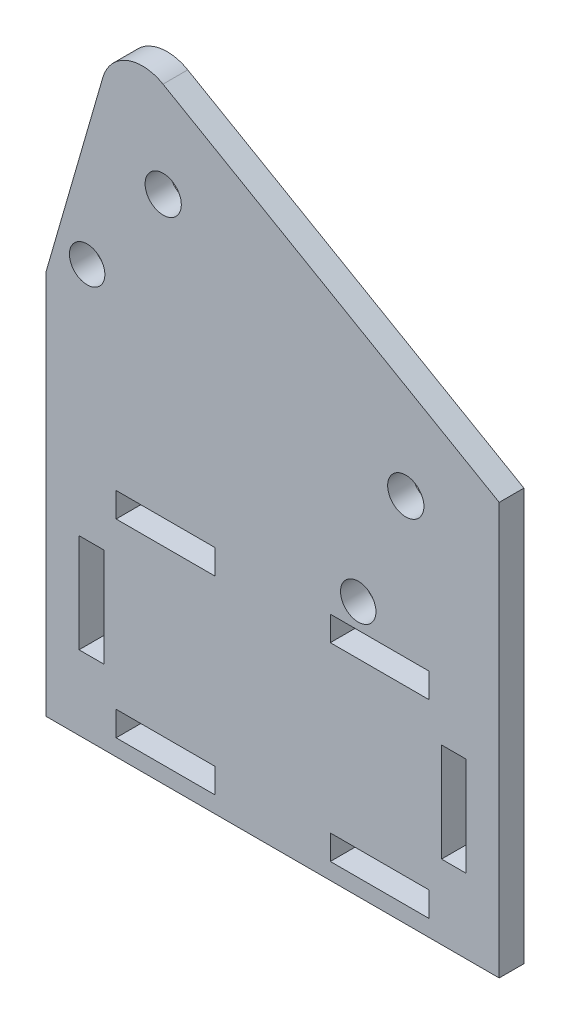
ISO-10303-21;
HEADER;
FILE_DESCRIPTION(('STEP AP214'),'2;1');
FILE_NAME('part.step','',(''),(''),'','','');
FILE_SCHEMA(('AUTOMOTIVE_DESIGN { 1 0 10303 214 1 1 1 1 }'));
ENDSEC;
DATA;
#1=APPLICATION_CONTEXT('core data for automotive mechanical design processes');
#2=APPLICATION_PROTOCOL_DEFINITION('international standard','automotive_design',2000,#1);
#3=PRODUCT_CONTEXT('',#1,'mechanical');
#4=PRODUCT('Part','Part','',(#3));
#5=PRODUCT_RELATED_PRODUCT_CATEGORY('part','',(#4));
#6=PRODUCT_DEFINITION_FORMATION('','',#4);
#7=PRODUCT_DEFINITION_CONTEXT('part definition',#1,'design');
#8=PRODUCT_DEFINITION('design','',#6,#7);
#9=PRODUCT_DEFINITION_SHAPE('','',#8);
#10=(LENGTH_UNIT() NAMED_UNIT(*) SI_UNIT(.MILLI.,.METRE.));
#11=(NAMED_UNIT(*) PLANE_ANGLE_UNIT() SI_UNIT($,.RADIAN.));
#12=(NAMED_UNIT(*) SI_UNIT($,.STERADIAN.) SOLID_ANGLE_UNIT());
#13=UNCERTAINTY_MEASURE_WITH_UNIT(LENGTH_MEASURE(1.E-05),#10,'distance_accuracy_value','');
#14=(GEOMETRIC_REPRESENTATION_CONTEXT(3) GLOBAL_UNCERTAINTY_ASSIGNED_CONTEXT((#13)) GLOBAL_UNIT_ASSIGNED_CONTEXT((#10,
#11,#12)) REPRESENTATION_CONTEXT('',''));
#15=CARTESIAN_POINT('',(0.,0.,0.));
#16=DIRECTION('',(0.,0.,1.));
#17=DIRECTION('',(1.,0.,0.));
#18=AXIS2_PLACEMENT_3D('',#15,#16,#17);
#19=CARTESIAN_POINT('',(22.0304445662279,38.157849302036,3.));
#20=DIRECTION('',(-0.500000000000004,-0.866025403784436,0.));
#21=DIRECTION('',(0.866025403784436,-0.500000000000004,0.));
#22=AXIS2_PLACEMENT_3D('',#19,#20,#21);
#23=PLANE('',#22);
#24=DIRECTION('',(-0.866025403784436,0.500000000000004,0.));
#25=VECTOR('',#24,1.);
#26=CARTESIAN_POINT('',(22.0304445662279,38.157849302036,0.));
#27=LINE('',#26,#25);
#28=CARTESIAN_POINT('',(27.5,35.,0.));
#29=VERTEX_POINT('',#28);
#30=CARTESIAN_POINT('',(-13.3076045347281,58.5602814631093,0.));
#31=VERTEX_POINT('',#30);
#32=EDGE_CURVE('E265',#29,#31,#27,.T.);
#33=ORIENTED_EDGE('',*,*,#32,.T.);
#34=DIRECTION('',(0.,0.,1.));
#35=VECTOR('',#34,1.);
#36=CARTESIAN_POINT('',(-13.3076045347281,58.5602814631093,3.));
#37=LINE('',#36,#35);
#38=CARTESIAN_POINT('',(-13.3076045347281,58.5602814631093,3.));
#39=VERTEX_POINT('',#38);
#40=EDGE_CURVE('E289',#31,#39,#37,.T.);
#41=ORIENTED_EDGE('',*,*,#40,.T.);
#42=DIRECTION('',(-0.866025403784436,0.500000000000004,0.));
#43=VECTOR('',#42,1.);
#44=CARTESIAN_POINT('',(22.0304445662279,38.157849302036,3.));
#45=LINE('',#44,#43);
#46=CARTESIAN_POINT('',(27.5,35.,3.));
#47=VERTEX_POINT('',#46);
#48=EDGE_CURVE('E255',#47,#39,#45,.T.);
#49=ORIENTED_EDGE('',*,*,#48,.F.);
#50=DIRECTION('',(0.,0.,-1.));
#51=VECTOR('',#50,1.);
#52=CARTESIAN_POINT('',(27.5,35.,3.));
#53=LINE('',#52,#51);
#54=EDGE_CURVE('E264',#47,#29,#53,.T.);
#55=ORIENTED_EDGE('',*,*,#54,.T.);
#56=EDGE_LOOP('',(#33,#41,#49,#55));
#57=FACE_BOUND('',#56,.T.);
#58=ADVANCED_FACE('F41',(#57),#23,.F.);
#59=CARTESIAN_POINT('',(-27.5,0.,3.));
#60=DIRECTION('',(1.,0.,0.));
#61=DIRECTION('',(0.,1.,0.));
#62=AXIS2_PLACEMENT_3D('',#59,#60,#61);
#63=PLANE('',#62);
#64=DIRECTION('',(0.,-1.,0.));
#65=VECTOR('',#64,1.);
#66=CARTESIAN_POINT('',(-27.5,0.,3.));
#67=LINE('',#66,#65);
#68=CARTESIAN_POINT('',(-27.5,31.7542648054294,3.));
#69=VERTEX_POINT('',#68);
#70=CARTESIAN_POINT('',(-27.5,-15.,3.));
#71=VERTEX_POINT('',#70);
#72=EDGE_CURVE('E246',#69,#71,#67,.T.);
#73=ORIENTED_EDGE('',*,*,#72,.F.);
#74=DIRECTION('',(0.,0.,1.));
#75=VECTOR('',#74,1.);
#76=CARTESIAN_POINT('',(-27.5,31.7542648054294,-7.));
#77=LINE('',#76,#75);
#78=CARTESIAN_POINT('',(-27.5,31.7542648054294,0.));
#79=VERTEX_POINT('',#78);
#80=EDGE_CURVE('E235',#79,#69,#77,.T.);
#81=ORIENTED_EDGE('',*,*,#80,.F.);
#82=DIRECTION('',(0.,-1.,0.));
#83=VECTOR('',#82,1.);
#84=CARTESIAN_POINT('',(-27.5,0.,0.));
#85=LINE('',#84,#83);
#86=CARTESIAN_POINT('',(-27.5,-15.,0.));
#87=VERTEX_POINT('',#86);
#88=EDGE_CURVE('E268',#79,#87,#85,.T.);
#89=ORIENTED_EDGE('',*,*,#88,.T.);
#90=DIRECTION('',(0.,0.,-1.));
#91=VECTOR('',#90,1.);
#92=CARTESIAN_POINT('',(-27.5,-15.,3.));
#93=LINE('',#92,#91);
#94=EDGE_CURVE('E252',#71,#87,#93,.T.);
#95=ORIENTED_EDGE('',*,*,#94,.F.);
#96=EDGE_LOOP('',(#73,#81,#89,#95));
#97=FACE_BOUND('',#96,.T.);
#98=ADVANCED_FACE('F250',(#97),#63,.F.);
#99=CARTESIAN_POINT('',(0.,-15.,3.));
#100=DIRECTION('',(0.,1.,0.));
#101=DIRECTION('',(0.,0.,1.));
#102=AXIS2_PLACEMENT_3D('',#99,#100,#101);
#103=PLANE('',#102);
#104=DIRECTION('',(1.,0.,0.));
#105=VECTOR('',#104,1.);
#106=CARTESIAN_POINT('',(0.,-15.,0.));
#107=LINE('',#106,#105);
#108=CARTESIAN_POINT('',(27.5,-15.,0.));
#109=VERTEX_POINT('',#108);
#110=EDGE_CURVE('E271',#87,#109,#107,.T.);
#111=ORIENTED_EDGE('',*,*,#110,.T.);
#112=DIRECTION('',(0.,0.,-1.));
#113=VECTOR('',#112,1.);
#114=CARTESIAN_POINT('',(27.5,-15.,3.));
#115=LINE('',#114,#113);
#116=CARTESIAN_POINT('',(27.5,-15.,3.));
#117=VERTEX_POINT('',#116);
#118=EDGE_CURVE('E276',#117,#109,#115,.T.);
#119=ORIENTED_EDGE('',*,*,#118,.F.);
#120=DIRECTION('',(1.,0.,0.));
#121=VECTOR('',#120,1.);
#122=CARTESIAN_POINT('',(0.,-15.,3.));
#123=LINE('',#122,#121);
#124=EDGE_CURVE('E254',#71,#117,#123,.T.);
#125=ORIENTED_EDGE('',*,*,#124,.F.);
#126=ORIENTED_EDGE('',*,*,#94,.T.);
#127=EDGE_LOOP('',(#111,#119,#125,#126));
#128=FACE_BOUND('',#127,.T.);
#129=ADVANCED_FACE('F322',(#128),#103,.F.);
#130=CARTESIAN_POINT('',(27.5,0.,3.));
#131=DIRECTION('',(-1.,0.,0.));
#132=DIRECTION('',(0.,-1.,0.));
#133=AXIS2_PLACEMENT_3D('',#130,#131,#132);
#134=PLANE('',#133);
#135=DIRECTION('',(0.,1.,0.));
#136=VECTOR('',#135,1.);
#137=CARTESIAN_POINT('',(27.5,0.,0.));
#138=LINE('',#137,#136);
#139=EDGE_CURVE('E259',#109,#29,#138,.T.);
#140=ORIENTED_EDGE('',*,*,#139,.T.);
#141=ORIENTED_EDGE('',*,*,#54,.F.);
#142=DIRECTION('',(0.,1.,0.));
#143=VECTOR('',#142,1.);
#144=CARTESIAN_POINT('',(27.5,0.,3.));
#145=LINE('',#144,#143);
#146=EDGE_CURVE('E257',#117,#47,#145,.T.);
#147=ORIENTED_EDGE('',*,*,#146,.F.);
#148=ORIENTED_EDGE('',*,*,#118,.T.);
#149=EDGE_LOOP('',(#140,#141,#147,#148));
#150=FACE_BOUND('',#149,.T.);
#151=ADVANCED_FACE('F302',(#150),#134,.F.);
#152=CARTESIAN_POINT('',(0.,0.,3.));
#153=DIRECTION('',(0.,0.,1.));
#154=DIRECTION('',(1.,0.,0.));
#155=AXIS2_PLACEMENT_3D('',#152,#153,#154);
#156=PLANE('',#155);
#157=CARTESIAN_POINT('',(10.3923048454121,16.0096189432334,3.));
#158=DIRECTION('',(0.,0.,-1.));
#159=DIRECTION('',(-1.,0.,0.));
#160=AXIS2_PLACEMENT_3D('',#157,#158,#159);
#161=CIRCLE('',#160,2.15);
#162=CARTESIAN_POINT('',(8.24230484541208,16.0096189432334,3.));
#163=VERTEX_POINT('',#162);
#164=EDGE_CURVE('E248',#163,#163,#161,.T.);
#165=ORIENTED_EDGE('',*,*,#164,.T.);
#166=EDGE_LOOP('',(#165));
#167=FACE_BOUND('',#166,.T.);
#168=CARTESIAN_POINT('',(-22.5166604983966,35.0096189432333,3.));
#169=DIRECTION('',(0.,0.,-1.));
#170=DIRECTION('',(-1.,0.,0.));
#171=AXIS2_PLACEMENT_3D('',#168,#169,#170);
#172=CIRCLE('',#171,2.15);
#173=CARTESIAN_POINT('',(-24.6666604983966,35.0096189432333,3.));
#174=VERTEX_POINT('',#173);
#175=EDGE_CURVE('E453',#174,#174,#172,.T.);
#176=ORIENTED_EDGE('',*,*,#175,.T.);
#177=EDGE_LOOP('',(#176));
#178=FACE_BOUND('',#177,.T.);
#179=ORIENTED_EDGE('',*,*,#48,.T.);
#180=CARTESIAN_POINT('',(-15.8076045347281,54.2301544441871,3.));
#181=DIRECTION('',(0.,0.,1.));
#182=DIRECTION('',(1.,0.,0.));
#183=AXIS2_PLACEMENT_3D('',#180,#181,#182);
#184=CIRCLE('',#183,5.);
#185=CARTESIAN_POINT('',(-20.6114491488808,55.6169049347502,3.));
#186=VERTEX_POINT('',#185);
#187=EDGE_CURVE('E63',#39,#186,#184,.T.);
#188=ORIENTED_EDGE('',*,*,#187,.T.);
#189=DIRECTION('',(0.277350098112614,0.960768922830523,0.));
#190=VECTOR('',#189,1.);
#191=CARTESIAN_POINT('',(-18.8397459621556,61.7542648054294,3.));
#192=LINE('',#191,#190);
#193=EDGE_CURVE('E237',#69,#186,#192,.T.);
#194=ORIENTED_EDGE('',*,*,#193,.F.);
#195=ORIENTED_EDGE('',*,*,#72,.T.);
#196=ORIENTED_EDGE('',*,*,#124,.T.);
#197=ORIENTED_EDGE('',*,*,#146,.T.);
#198=EDGE_LOOP('',(#179,#188,#194,#195,#196,#197));
#199=FACE_BOUND('',#198,.T.);
#200=CARTESIAN_POINT('',(-13.2846096908265,47.,3.));
#201=DIRECTION('',(0.,0.,1.));
#202=DIRECTION('',(1.,0.,0.));
#203=AXIS2_PLACEMENT_3D('',#200,#201,#202);
#204=CIRCLE('',#203,2.2);
#205=CARTESIAN_POINT('',(-11.0846096908265,47.,3.));
#206=VERTEX_POINT('',#205);
#207=EDGE_CURVE('E284',#206,#206,#204,.T.);
#208=ORIENTED_EDGE('',*,*,#207,.F.);
#209=EDGE_LOOP('',(#208));
#210=FACE_BOUND('',#209,.T.);
#211=CARTESIAN_POINT('',(16.1602540378444,30.,3.));
#212=DIRECTION('',(0.,0.,1.));
#213=DIRECTION('',(1.,0.,0.));
#214=AXIS2_PLACEMENT_3D('',#211,#212,#213);
#215=CIRCLE('',#214,2.2);
#216=CARTESIAN_POINT('',(18.3602540378444,30.,3.));
#217=VERTEX_POINT('',#216);
#218=EDGE_CURVE('E242',#217,#217,#215,.T.);
#219=ORIENTED_EDGE('',*,*,#218,.F.);
#220=EDGE_LOOP('',(#219));
#221=FACE_BOUND('',#220,.T.);
#222=DIRECTION('',(0.,1.,0.));
#223=VECTOR('',#222,1.);
#224=CARTESIAN_POINT('',(23.5,6.,3.));
#225=LINE('',#224,#223);
#226=CARTESIAN_POINT('',(23.5,-6.,3.));
#227=VERTEX_POINT('',#226);
#228=CARTESIAN_POINT('',(23.5,6.,3.));
#229=VERTEX_POINT('',#228);
#230=EDGE_CURVE('E570',#227,#229,#225,.T.);
#231=ORIENTED_EDGE('',*,*,#230,.F.);
#232=DIRECTION('',(1.,0.,0.));
#233=VECTOR('',#232,1.);
#234=CARTESIAN_POINT('',(23.5,-6.,3.));
#235=LINE('',#234,#233);
#236=CARTESIAN_POINT('',(20.5,-6.,3.));
#237=VERTEX_POINT('',#236);
#238=EDGE_CURVE('E601',#237,#227,#235,.T.);
#239=ORIENTED_EDGE('',*,*,#238,.F.);
#240=DIRECTION('',(0.,-1.,0.));
#241=VECTOR('',#240,1.);
#242=CARTESIAN_POINT('',(20.5,6.,3.));
#243=LINE('',#242,#241);
#244=CARTESIAN_POINT('',(20.5,6.,3.));
#245=VERTEX_POINT('',#244);
#246=EDGE_CURVE('E604',#245,#237,#243,.T.);
#247=ORIENTED_EDGE('',*,*,#246,.F.);
#248=DIRECTION('',(-1.,0.,0.));
#249=VECTOR('',#248,1.);
#250=CARTESIAN_POINT('',(23.5,6.,3.));
#251=LINE('',#250,#249);
#252=EDGE_CURVE('E608',#229,#245,#251,.T.);
#253=ORIENTED_EDGE('',*,*,#252,.F.);
#254=EDGE_LOOP('',(#231,#239,#247,#253));
#255=FACE_BOUND('',#254,.T.);
#256=DIRECTION('',(0.,-1.,0.));
#257=VECTOR('',#256,1.);
#258=CARTESIAN_POINT('',(-23.5,6.,3.));
#259=LINE('',#258,#257);
#260=CARTESIAN_POINT('',(-23.5,6.,3.));
#261=VERTEX_POINT('',#260);
#262=CARTESIAN_POINT('',(-23.5,-6.,3.));
#263=VERTEX_POINT('',#262);
#264=EDGE_CURVE('E538',#261,#263,#259,.T.);
#265=ORIENTED_EDGE('',*,*,#264,.F.);
#266=DIRECTION('',(-1.,0.,0.));
#267=VECTOR('',#266,1.);
#268=CARTESIAN_POINT('',(-23.5,6.,3.));
#269=LINE('',#268,#267);
#270=CARTESIAN_POINT('',(-20.5,6.,3.));
#271=VERTEX_POINT('',#270);
#272=EDGE_CURVE('E571',#271,#261,#269,.T.);
#273=ORIENTED_EDGE('',*,*,#272,.F.);
#274=DIRECTION('',(0.,1.,0.));
#275=VECTOR('',#274,1.);
#276=CARTESIAN_POINT('',(-20.5,6.,3.));
#277=LINE('',#276,#275);
#278=CARTESIAN_POINT('',(-20.5,-6.,3.));
#279=VERTEX_POINT('',#278);
#280=EDGE_CURVE('E574',#279,#271,#277,.T.);
#281=ORIENTED_EDGE('',*,*,#280,.F.);
#282=DIRECTION('',(1.,0.,0.));
#283=VECTOR('',#282,1.);
#284=CARTESIAN_POINT('',(-23.5,-6.,3.));
#285=LINE('',#284,#283);
#286=EDGE_CURVE('E578',#263,#279,#285,.T.);
#287=ORIENTED_EDGE('',*,*,#286,.F.);
#288=EDGE_LOOP('',(#265,#273,#281,#287));
#289=FACE_BOUND('',#288,.T.);
#290=DIRECTION('',(0.,-1.,0.));
#291=VECTOR('',#290,1.);
#292=CARTESIAN_POINT('',(-19.,13.,3.));
#293=LINE('',#292,#291);
#294=CARTESIAN_POINT('',(-19.,13.,3.));
#295=VERTEX_POINT('',#294);
#296=CARTESIAN_POINT('',(-19.,10.,3.));
#297=VERTEX_POINT('',#296);
#298=EDGE_CURVE('E506',#295,#297,#293,.T.);
#299=ORIENTED_EDGE('',*,*,#298,.F.);
#300=DIRECTION('',(-1.,0.,0.));
#301=VECTOR('',#300,1.);
#302=CARTESIAN_POINT('',(-19.,13.,3.));
#303=LINE('',#302,#301);
#304=CARTESIAN_POINT('',(-7.,13.,3.));
#305=VERTEX_POINT('',#304);
#306=EDGE_CURVE('E539',#305,#295,#303,.T.);
#307=ORIENTED_EDGE('',*,*,#306,.F.);
#308=DIRECTION('',(0.,1.,0.));
#309=VECTOR('',#308,1.);
#310=CARTESIAN_POINT('',(-7.,13.,3.));
#311=LINE('',#310,#309);
#312=CARTESIAN_POINT('',(-7.,10.,3.));
#313=VERTEX_POINT('',#312);
#314=EDGE_CURVE('E542',#313,#305,#311,.T.);
#315=ORIENTED_EDGE('',*,*,#314,.F.);
#316=DIRECTION('',(1.,0.,0.));
#317=VECTOR('',#316,1.);
#318=CARTESIAN_POINT('',(-19.,10.,3.));
#319=LINE('',#318,#317);
#320=EDGE_CURVE('E546',#297,#313,#319,.T.);
#321=ORIENTED_EDGE('',*,*,#320,.F.);
#322=EDGE_LOOP('',(#299,#307,#315,#321));
#323=FACE_BOUND('',#322,.T.);
#324=DIRECTION('',(-1.,0.,0.));
#325=VECTOR('',#324,1.);
#326=CARTESIAN_POINT('',(19.,13.,3.));
#327=LINE('',#326,#325);
#328=CARTESIAN_POINT('',(19.,13.,3.));
#329=VERTEX_POINT('',#328);
#330=CARTESIAN_POINT('',(7.,13.,3.));
#331=VERTEX_POINT('',#330);
#332=EDGE_CURVE('E472',#329,#331,#327,.T.);
#333=ORIENTED_EDGE('',*,*,#332,.F.);
#334=DIRECTION('',(0.,1.,0.));
#335=VECTOR('',#334,1.);
#336=CARTESIAN_POINT('',(19.,13.,3.));
#337=LINE('',#336,#335);
#338=CARTESIAN_POINT('',(19.,10.,3.));
#339=VERTEX_POINT('',#338);
#340=EDGE_CURVE('E507',#339,#329,#337,.T.);
#341=ORIENTED_EDGE('',*,*,#340,.F.);
#342=DIRECTION('',(1.,0.,0.));
#343=VECTOR('',#342,1.);
#344=CARTESIAN_POINT('',(19.,10.,3.));
#345=LINE('',#344,#343);
#346=CARTESIAN_POINT('',(7.,10.,3.));
#347=VERTEX_POINT('',#346);
#348=EDGE_CURVE('E510',#347,#339,#345,.T.);
#349=ORIENTED_EDGE('',*,*,#348,.F.);
#350=DIRECTION('',(0.,-1.,0.));
#351=VECTOR('',#350,1.);
#352=CARTESIAN_POINT('',(7.,13.,3.));
#353=LINE('',#352,#351);
#354=EDGE_CURVE('E514',#331,#347,#353,.T.);
#355=ORIENTED_EDGE('',*,*,#354,.F.);
#356=EDGE_LOOP('',(#333,#341,#349,#355));
#357=FACE_BOUND('',#356,.T.);
#358=DIRECTION('',(0.,1.,0.));
#359=VECTOR('',#358,1.);
#360=CARTESIAN_POINT('',(19.,-13.,3.));
#361=LINE('',#360,#359);
#362=CARTESIAN_POINT('',(19.,-13.,3.));
#363=VERTEX_POINT('',#362);
#364=CARTESIAN_POINT('',(19.,-10.,3.));
#365=VERTEX_POINT('',#364);
#366=EDGE_CURVE('E483',#363,#365,#361,.T.);
#367=ORIENTED_EDGE('',*,*,#366,.F.);
#368=DIRECTION('',(1.,0.,0.));
#369=VECTOR('',#368,1.);
#370=CARTESIAN_POINT('',(19.,-13.,3.));
#371=LINE('',#370,#369);
#372=CARTESIAN_POINT('',(7.,-13.,3.));
#373=VERTEX_POINT('',#372);
#374=EDGE_CURVE('E473',#373,#363,#371,.T.);
#375=ORIENTED_EDGE('',*,*,#374,.F.);
#376=DIRECTION('',(0.,-1.,0.));
#377=VECTOR('',#376,1.);
#378=CARTESIAN_POINT('',(7.,-13.,3.));
#379=LINE('',#378,#377);
#380=CARTESIAN_POINT('',(7.,-10.,3.));
#381=VERTEX_POINT('',#380);
#382=EDGE_CURVE('E476',#381,#373,#379,.T.);
#383=ORIENTED_EDGE('',*,*,#382,.F.);
#384=DIRECTION('',(-1.,0.,0.));
#385=VECTOR('',#384,1.);
#386=CARTESIAN_POINT('',(19.,-10.,3.));
#387=LINE('',#386,#385);
#388=EDGE_CURVE('E480',#365,#381,#387,.T.);
#389=ORIENTED_EDGE('',*,*,#388,.F.);
#390=EDGE_LOOP('',(#367,#375,#383,#389));
#391=FACE_BOUND('',#390,.T.);
#392=DIRECTION('',(0.,-1.,0.));
#393=VECTOR('',#392,1.);
#394=CARTESIAN_POINT('',(-19.,-13.,3.));
#395=LINE('',#394,#393);
#396=CARTESIAN_POINT('',(-19.,-10.,3.));
#397=VERTEX_POINT('',#396);
#398=CARTESIAN_POINT('',(-19.,-13.,3.));
#399=VERTEX_POINT('',#398);
#400=EDGE_CURVE('E485',#397,#399,#395,.T.);
#401=ORIENTED_EDGE('',*,*,#400,.F.);
#402=DIRECTION('',(-1.,0.,0.));
#403=VECTOR('',#402,1.);
#404=CARTESIAN_POINT('',(-19.,-10.,3.));
#405=LINE('',#404,#403);
#406=CARTESIAN_POINT('',(-7.,-10.,3.));
#407=VERTEX_POINT('',#406);
#408=EDGE_CURVE('E626',#407,#397,#405,.T.);
#409=ORIENTED_EDGE('',*,*,#408,.F.);
#410=DIRECTION('',(0.,1.,0.));
#411=VECTOR('',#410,1.);
#412=CARTESIAN_POINT('',(-7.,-13.,3.));
#413=LINE('',#412,#411);
#414=CARTESIAN_POINT('',(-7.,-13.,3.));
#415=VERTEX_POINT('',#414);
#416=EDGE_CURVE('E640',#415,#407,#413,.T.);
#417=ORIENTED_EDGE('',*,*,#416,.F.);
#418=DIRECTION('',(1.,0.,0.));
#419=VECTOR('',#418,1.);
#420=CARTESIAN_POINT('',(-19.,-13.,3.));
#421=LINE('',#420,#419);
#422=EDGE_CURVE('E637',#399,#415,#421,.T.);
#423=ORIENTED_EDGE('',*,*,#422,.F.);
#424=EDGE_LOOP('',(#401,#409,#417,#423));
#425=FACE_BOUND('',#424,.T.);
#426=ADVANCED_FACE('F244',(#167,#178,#199,#210,#221,#255,#289,#323,#357,#391,#425),#156,.T.);
#427=CARTESIAN_POINT('',(0.,0.,0.));
#428=DIRECTION('',(0.,0.,1.));
#429=DIRECTION('',(1.,0.,0.));
#430=AXIS2_PLACEMENT_3D('',#427,#428,#429);
#431=PLANE('',#430);
#432=CARTESIAN_POINT('',(10.3923048454121,16.0096189432334,0.));
#433=DIRECTION('',(0.,0.,-1.));
#434=DIRECTION('',(-1.,0.,0.));
#435=AXIS2_PLACEMENT_3D('',#432,#433,#434);
#436=CIRCLE('',#435,2.15);
#437=CARTESIAN_POINT('',(8.24230484541208,16.0096189432334,0.));
#438=VERTEX_POINT('',#437);
#439=EDGE_CURVE('E448',#438,#438,#436,.T.);
#440=ORIENTED_EDGE('',*,*,#439,.F.);
#441=EDGE_LOOP('',(#440));
#442=FACE_BOUND('',#441,.T.);
#443=CARTESIAN_POINT('',(-22.5166604983966,35.0096189432333,0.));
#444=DIRECTION('',(0.,0.,-1.));
#445=DIRECTION('',(-1.,0.,0.));
#446=AXIS2_PLACEMENT_3D('',#443,#444,#445);
#447=CIRCLE('',#446,2.15);
#448=CARTESIAN_POINT('',(-24.6666604983966,35.0096189432333,0.));
#449=VERTEX_POINT('',#448);
#450=EDGE_CURVE('E449',#449,#449,#447,.T.);
#451=ORIENTED_EDGE('',*,*,#450,.F.);
#452=EDGE_LOOP('',(#451));
#453=FACE_BOUND('',#452,.T.);
#454=CARTESIAN_POINT('',(-13.2846096908265,47.,0.));
#455=DIRECTION('',(0.,0.,1.));
#456=DIRECTION('',(1.,0.,0.));
#457=AXIS2_PLACEMENT_3D('',#454,#455,#456);
#458=CIRCLE('',#457,2.2);
#459=CARTESIAN_POINT('',(-11.0846096908265,47.,0.));
#460=VERTEX_POINT('',#459);
#461=EDGE_CURVE('E283',#460,#460,#458,.T.);
#462=ORIENTED_EDGE('',*,*,#461,.T.);
#463=EDGE_LOOP('',(#462));
#464=FACE_BOUND('',#463,.T.);
#465=CARTESIAN_POINT('',(16.1602540378444,30.,0.));
#466=DIRECTION('',(0.,0.,1.));
#467=DIRECTION('',(1.,0.,0.));
#468=AXIS2_PLACEMENT_3D('',#465,#466,#467);
#469=CIRCLE('',#468,2.2);
#470=CARTESIAN_POINT('',(18.3602540378444,30.,0.));
#471=VERTEX_POINT('',#470);
#472=EDGE_CURVE('E280',#471,#471,#469,.T.);
#473=ORIENTED_EDGE('',*,*,#472,.T.);
#474=EDGE_LOOP('',(#473));
#475=FACE_BOUND('',#474,.T.);
#476=DIRECTION('',(1.,0.,0.));
#477=VECTOR('',#476,1.);
#478=CARTESIAN_POINT('',(23.5,-6.,0.));
#479=LINE('',#478,#477);
#480=CARTESIAN_POINT('',(20.5,-6.,0.));
#481=VERTEX_POINT('',#480);
#482=CARTESIAN_POINT('',(23.5,-6.,0.));
#483=VERTEX_POINT('',#482);
#484=EDGE_CURVE('E595',#481,#483,#479,.T.);
#485=ORIENTED_EDGE('',*,*,#484,.T.);
#486=DIRECTION('',(0.,1.,0.));
#487=VECTOR('',#486,1.);
#488=CARTESIAN_POINT('',(23.5,6.,0.));
#489=LINE('',#488,#487);
#490=CARTESIAN_POINT('',(23.5,6.,0.));
#491=VERTEX_POINT('',#490);
#492=EDGE_CURVE('E605',#483,#491,#489,.T.);
#493=ORIENTED_EDGE('',*,*,#492,.T.);
#494=DIRECTION('',(-1.,0.,0.));
#495=VECTOR('',#494,1.);
#496=CARTESIAN_POINT('',(23.5,6.,0.));
#497=LINE('',#496,#495);
#498=CARTESIAN_POINT('',(20.5,6.,0.));
#499=VERTEX_POINT('',#498);
#500=EDGE_CURVE('E617',#491,#499,#497,.T.);
#501=ORIENTED_EDGE('',*,*,#500,.T.);
#502=DIRECTION('',(0.,-1.,0.));
#503=VECTOR('',#502,1.);
#504=CARTESIAN_POINT('',(20.5,6.,0.));
#505=LINE('',#504,#503);
#506=EDGE_CURVE('E614',#499,#481,#505,.T.);
#507=ORIENTED_EDGE('',*,*,#506,.T.);
#508=EDGE_LOOP('',(#485,#493,#501,#507));
#509=FACE_BOUND('',#508,.T.);
#510=DIRECTION('',(-1.,0.,0.));
#511=VECTOR('',#510,1.);
#512=CARTESIAN_POINT('',(-23.5,6.,0.));
#513=LINE('',#512,#511);
#514=CARTESIAN_POINT('',(-20.5,6.,0.));
#515=VERTEX_POINT('',#514);
#516=CARTESIAN_POINT('',(-23.5,6.,0.));
#517=VERTEX_POINT('',#516);
#518=EDGE_CURVE('E563',#515,#517,#513,.T.);
#519=ORIENTED_EDGE('',*,*,#518,.T.);
#520=DIRECTION('',(0.,-1.,0.));
#521=VECTOR('',#520,1.);
#522=CARTESIAN_POINT('',(-23.5,6.,0.));
#523=LINE('',#522,#521);
#524=CARTESIAN_POINT('',(-23.5,-6.,0.));
#525=VERTEX_POINT('',#524);
#526=EDGE_CURVE('E575',#517,#525,#523,.T.);
#527=ORIENTED_EDGE('',*,*,#526,.T.);
#528=DIRECTION('',(1.,0.,0.));
#529=VECTOR('',#528,1.);
#530=CARTESIAN_POINT('',(-23.5,-6.,0.));
#531=LINE('',#530,#529);
#532=CARTESIAN_POINT('',(-20.5,-6.,0.));
#533=VERTEX_POINT('',#532);
#534=EDGE_CURVE('E587',#525,#533,#531,.T.);
#535=ORIENTED_EDGE('',*,*,#534,.T.);
#536=DIRECTION('',(0.,1.,0.));
#537=VECTOR('',#536,1.);
#538=CARTESIAN_POINT('',(-20.5,6.,0.));
#539=LINE('',#538,#537);
#540=EDGE_CURVE('E584',#533,#515,#539,.T.);
#541=ORIENTED_EDGE('',*,*,#540,.T.);
#542=EDGE_LOOP('',(#519,#527,#535,#541));
#543=FACE_BOUND('',#542,.T.);
#544=DIRECTION('',(-1.,0.,0.));
#545=VECTOR('',#544,1.);
#546=CARTESIAN_POINT('',(-19.,13.,0.));
#547=LINE('',#546,#545);
#548=CARTESIAN_POINT('',(-7.,13.,0.));
#549=VERTEX_POINT('',#548);
#550=CARTESIAN_POINT('',(-19.,13.,0.));
#551=VERTEX_POINT('',#550);
#552=EDGE_CURVE('E531',#549,#551,#547,.T.);
#553=ORIENTED_EDGE('',*,*,#552,.T.);
#554=DIRECTION('',(0.,-1.,0.));
#555=VECTOR('',#554,1.);
#556=CARTESIAN_POINT('',(-19.,13.,0.));
#557=LINE('',#556,#555);
#558=CARTESIAN_POINT('',(-19.,10.,0.));
#559=VERTEX_POINT('',#558);
#560=EDGE_CURVE('E543',#551,#559,#557,.T.);
#561=ORIENTED_EDGE('',*,*,#560,.T.);
#562=DIRECTION('',(1.,0.,0.));
#563=VECTOR('',#562,1.);
#564=CARTESIAN_POINT('',(-19.,10.,0.));
#565=LINE('',#564,#563);
#566=CARTESIAN_POINT('',(-7.,10.,0.));
#567=VERTEX_POINT('',#566);
#568=EDGE_CURVE('E555',#559,#567,#565,.T.);
#569=ORIENTED_EDGE('',*,*,#568,.T.);
#570=DIRECTION('',(0.,1.,0.));
#571=VECTOR('',#570,1.);
#572=CARTESIAN_POINT('',(-7.,13.,0.));
#573=LINE('',#572,#571);
#574=EDGE_CURVE('E552',#567,#549,#573,.T.);
#575=ORIENTED_EDGE('',*,*,#574,.T.);
#576=EDGE_LOOP('',(#553,#561,#569,#575));
#577=FACE_BOUND('',#576,.T.);
#578=DIRECTION('',(0.,1.,0.));
#579=VECTOR('',#578,1.);
#580=CARTESIAN_POINT('',(19.,13.,0.));
#581=LINE('',#580,#579);
#582=CARTESIAN_POINT('',(19.,10.,0.));
#583=VERTEX_POINT('',#582);
#584=CARTESIAN_POINT('',(19.,13.,0.));
#585=VERTEX_POINT('',#584);
#586=EDGE_CURVE('E499',#583,#585,#581,.T.);
#587=ORIENTED_EDGE('',*,*,#586,.T.);
#588=DIRECTION('',(-1.,0.,0.));
#589=VECTOR('',#588,1.);
#590=CARTESIAN_POINT('',(19.,13.,0.));
#591=LINE('',#590,#589);
#592=CARTESIAN_POINT('',(7.,13.,0.));
#593=VERTEX_POINT('',#592);
#594=EDGE_CURVE('E511',#585,#593,#591,.T.);
#595=ORIENTED_EDGE('',*,*,#594,.T.);
#596=DIRECTION('',(0.,-1.,0.));
#597=VECTOR('',#596,1.);
#598=CARTESIAN_POINT('',(7.,13.,0.));
#599=LINE('',#598,#597);
#600=CARTESIAN_POINT('',(7.,10.,0.));
#601=VERTEX_POINT('',#600);
#602=EDGE_CURVE('E523',#593,#601,#599,.T.);
#603=ORIENTED_EDGE('',*,*,#602,.T.);
#604=DIRECTION('',(1.,0.,0.));
#605=VECTOR('',#604,1.);
#606=CARTESIAN_POINT('',(19.,10.,0.));
#607=LINE('',#606,#605);
#608=EDGE_CURVE('E520',#601,#583,#607,.T.);
#609=ORIENTED_EDGE('',*,*,#608,.T.);
#610=EDGE_LOOP('',(#587,#595,#603,#609));
#611=FACE_BOUND('',#610,.T.);
#612=DIRECTION('',(1.,0.,0.));
#613=VECTOR('',#612,1.);
#614=CARTESIAN_POINT('',(19.,-13.,0.));
#615=LINE('',#614,#613);
#616=CARTESIAN_POINT('',(7.,-13.,0.));
#617=VERTEX_POINT('',#616);
#618=CARTESIAN_POINT('',(19.,-13.,0.));
#619=VERTEX_POINT('',#618);
#620=EDGE_CURVE('E465',#617,#619,#615,.T.);
#621=ORIENTED_EDGE('',*,*,#620,.T.);
#622=DIRECTION('',(0.,1.,0.));
#623=VECTOR('',#622,1.);
#624=CARTESIAN_POINT('',(19.,-13.,0.));
#625=LINE('',#624,#623);
#626=CARTESIAN_POINT('',(19.,-10.,0.));
#627=VERTEX_POINT('',#626);
#628=EDGE_CURVE('E477',#619,#627,#625,.T.);
#629=ORIENTED_EDGE('',*,*,#628,.T.);
#630=DIRECTION('',(-1.,0.,0.));
#631=VECTOR('',#630,1.);
#632=CARTESIAN_POINT('',(19.,-10.,0.));
#633=LINE('',#632,#631);
#634=CARTESIAN_POINT('',(7.,-10.,0.));
#635=VERTEX_POINT('',#634);
#636=EDGE_CURVE('E491',#627,#635,#633,.T.);
#637=ORIENTED_EDGE('',*,*,#636,.T.);
#638=DIRECTION('',(0.,-1.,0.));
#639=VECTOR('',#638,1.);
#640=CARTESIAN_POINT('',(7.,-13.,0.));
#641=LINE('',#640,#639);
#642=EDGE_CURVE('E488',#635,#617,#641,.T.);
#643=ORIENTED_EDGE('',*,*,#642,.T.);
#644=EDGE_LOOP('',(#621,#629,#637,#643));
#645=FACE_BOUND('',#644,.T.);
#646=DIRECTION('',(-1.,0.,0.));
#647=VECTOR('',#646,1.);
#648=CARTESIAN_POINT('',(-19.,-10.,0.));
#649=LINE('',#648,#647);
#650=CARTESIAN_POINT('',(-7.,-10.,0.));
#651=VERTEX_POINT('',#650);
#652=CARTESIAN_POINT('',(-19.,-10.,0.));
#653=VERTEX_POINT('',#652);
#654=EDGE_CURVE('E632',#651,#653,#649,.T.);
#655=ORIENTED_EDGE('',*,*,#654,.T.);
#656=DIRECTION('',(0.,-1.,0.));
#657=VECTOR('',#656,1.);
#658=CARTESIAN_POINT('',(-19.,-13.,0.));
#659=LINE('',#658,#657);
#660=CARTESIAN_POINT('',(-19.,-13.,0.));
#661=VERTEX_POINT('',#660);
#662=EDGE_CURVE('E622',#653,#661,#659,.T.);
#663=ORIENTED_EDGE('',*,*,#662,.T.);
#664=DIRECTION('',(1.,0.,0.));
#665=VECTOR('',#664,1.);
#666=CARTESIAN_POINT('',(-19.,-13.,0.));
#667=LINE('',#666,#665);
#668=CARTESIAN_POINT('',(-7.,-13.,0.));
#669=VERTEX_POINT('',#668);
#670=EDGE_CURVE('E625',#661,#669,#667,.T.);
#671=ORIENTED_EDGE('',*,*,#670,.T.);
#672=DIRECTION('',(0.,1.,0.));
#673=VECTOR('',#672,1.);
#674=CARTESIAN_POINT('',(-7.,-13.,0.));
#675=LINE('',#674,#673);
#676=EDGE_CURVE('E629',#669,#651,#675,.T.);
#677=ORIENTED_EDGE('',*,*,#676,.T.);
#678=EDGE_LOOP('',(#655,#663,#671,#677));
#679=FACE_BOUND('',#678,.T.);
#680=DIRECTION('',(0.277350098112614,0.960768922830523,0.));
#681=VECTOR('',#680,1.);
#682=CARTESIAN_POINT('',(-33.8461538461539,9.7705430170552,0.));
#683=LINE('',#682,#681);
#684=CARTESIAN_POINT('',(-20.6114491488808,55.6169049347502,0.));
#685=VERTEX_POINT('',#684);
#686=EDGE_CURVE('E238',#79,#685,#683,.T.);
#687=ORIENTED_EDGE('',*,*,#686,.T.);
#688=CARTESIAN_POINT('',(-15.8076045347281,54.2301544441871,0.));
#689=DIRECTION('',(0.,0.,1.));
#690=DIRECTION('',(1.,0.,0.));
#691=AXIS2_PLACEMENT_3D('',#688,#689,#690);
#692=CIRCLE('',#691,5.);
#693=EDGE_CURVE('E11',#685,#31,#692,.F.);
#694=ORIENTED_EDGE('',*,*,#693,.T.);
#695=ORIENTED_EDGE('',*,*,#32,.F.);
#696=ORIENTED_EDGE('',*,*,#139,.F.);
#697=ORIENTED_EDGE('',*,*,#110,.F.);
#698=ORIENTED_EDGE('',*,*,#88,.F.);
#699=EDGE_LOOP('',(#687,#694,#695,#696,#697,#698));
#700=FACE_BOUND('',#699,.T.);
#701=ADVANCED_FACE('F305',(#442,#453,#464,#475,#509,#543,#577,#611,#645,#679,#700),#431,.F.);
#702=CARTESIAN_POINT('',(-19.,-13.,0.));
#703=DIRECTION('',(-1.,0.,0.));
#704=DIRECTION('',(0.,0.,1.));
#705=AXIS2_PLACEMENT_3D('',#702,#703,#704);
#706=PLANE('',#705);
#707=ORIENTED_EDGE('',*,*,#400,.T.);
#708=DIRECTION('',(0.,0.,1.));
#709=VECTOR('',#708,1.);
#710=CARTESIAN_POINT('',(-19.,-13.,0.));
#711=LINE('',#710,#709);
#712=EDGE_CURVE('E635',#661,#399,#711,.T.);
#713=ORIENTED_EDGE('',*,*,#712,.F.);
#714=ORIENTED_EDGE('',*,*,#662,.F.);
#715=DIRECTION('',(0.,0.,1.));
#716=VECTOR('',#715,1.);
#717=CARTESIAN_POINT('',(-19.,-10.,0.));
#718=LINE('',#717,#716);
#719=EDGE_CURVE('E269',#653,#397,#718,.T.);
#720=ORIENTED_EDGE('',*,*,#719,.T.);
#721=EDGE_LOOP('',(#707,#713,#714,#720));
#722=FACE_BOUND('',#721,.T.);
#723=ADVANCED_FACE('F332',(#722),#706,.F.);
#724=CARTESIAN_POINT('',(-19.,-10.,0.));
#725=DIRECTION('',(0.,1.,0.));
#726=DIRECTION('',(0.,0.,1.));
#727=AXIS2_PLACEMENT_3D('',#724,#725,#726);
#728=PLANE('',#727);
#729=ORIENTED_EDGE('',*,*,#408,.T.);
#730=ORIENTED_EDGE('',*,*,#719,.F.);
#731=ORIENTED_EDGE('',*,*,#654,.F.);
#732=DIRECTION('',(0.,0.,1.));
#733=VECTOR('',#732,1.);
#734=CARTESIAN_POINT('',(-7.,-10.,0.));
#735=LINE('',#734,#733);
#736=EDGE_CURVE('E646',#651,#407,#735,.T.);
#737=ORIENTED_EDGE('',*,*,#736,.T.);
#738=EDGE_LOOP('',(#729,#730,#731,#737));
#739=FACE_BOUND('',#738,.T.);
#740=ADVANCED_FACE('F339',(#739),#728,.F.);
#741=CARTESIAN_POINT('',(-7.,-13.,0.));
#742=DIRECTION('',(1.,0.,0.));
#743=DIRECTION('',(0.,0.,-1.));
#744=AXIS2_PLACEMENT_3D('',#741,#742,#743);
#745=PLANE('',#744);
#746=ORIENTED_EDGE('',*,*,#416,.T.);
#747=ORIENTED_EDGE('',*,*,#736,.F.);
#748=ORIENTED_EDGE('',*,*,#676,.F.);
#749=DIRECTION('',(0.,0.,1.));
#750=VECTOR('',#749,1.);
#751=CARTESIAN_POINT('',(-7.,-13.,0.));
#752=LINE('',#751,#750);
#753=EDGE_CURVE('E648',#669,#415,#752,.T.);
#754=ORIENTED_EDGE('',*,*,#753,.T.);
#755=EDGE_LOOP('',(#746,#747,#748,#754));
#756=FACE_BOUND('',#755,.T.);
#757=ADVANCED_FACE('F345',(#756),#745,.F.);
#758=CARTESIAN_POINT('',(-19.,-13.,0.));
#759=DIRECTION('',(0.,-1.,0.));
#760=DIRECTION('',(0.,0.,-1.));
#761=AXIS2_PLACEMENT_3D('',#758,#759,#760);
#762=PLANE('',#761);
#763=ORIENTED_EDGE('',*,*,#422,.T.);
#764=ORIENTED_EDGE('',*,*,#753,.F.);
#765=ORIENTED_EDGE('',*,*,#670,.F.);
#766=ORIENTED_EDGE('',*,*,#712,.T.);
#767=EDGE_LOOP('',(#763,#764,#765,#766));
#768=FACE_BOUND('',#767,.T.);
#769=ADVANCED_FACE('F341',(#768),#762,.F.);
#770=CARTESIAN_POINT('',(19.,-13.,0.));
#771=DIRECTION('',(1.,0.,0.));
#772=DIRECTION('',(0.,0.,-1.));
#773=AXIS2_PLACEMENT_3D('',#770,#771,#772);
#774=PLANE('',#773);
#775=ORIENTED_EDGE('',*,*,#366,.T.);
#776=DIRECTION('',(0.,0.,1.));
#777=VECTOR('',#776,1.);
#778=CARTESIAN_POINT('',(19.,-10.,0.));
#779=LINE('',#778,#777);
#780=EDGE_CURVE('E462',#627,#365,#779,.T.);
#781=ORIENTED_EDGE('',*,*,#780,.F.);
#782=ORIENTED_EDGE('',*,*,#628,.F.);
#783=DIRECTION('',(0.,0.,1.));
#784=VECTOR('',#783,1.);
#785=CARTESIAN_POINT('',(19.,-13.,0.));
#786=LINE('',#785,#784);
#787=EDGE_CURVE('E470',#619,#363,#786,.T.);
#788=ORIENTED_EDGE('',*,*,#787,.T.);
#789=EDGE_LOOP('',(#775,#781,#782,#788));
#790=FACE_BOUND('',#789,.T.);
#791=ADVANCED_FACE('F344',(#790),#774,.F.);
#792=CARTESIAN_POINT('',(19.,-13.,0.));
#793=DIRECTION('',(0.,-1.,0.));
#794=DIRECTION('',(1.,0.,0.));
#795=AXIS2_PLACEMENT_3D('',#792,#793,#794);
#796=PLANE('',#795);
#797=ORIENTED_EDGE('',*,*,#374,.T.);
#798=ORIENTED_EDGE('',*,*,#787,.F.);
#799=ORIENTED_EDGE('',*,*,#620,.F.);
#800=DIRECTION('',(0.,0.,1.));
#801=VECTOR('',#800,1.);
#802=CARTESIAN_POINT('',(7.,-13.,0.));
#803=LINE('',#802,#801);
#804=EDGE_CURVE('E468',#617,#373,#803,.T.);
#805=ORIENTED_EDGE('',*,*,#804,.T.);
#806=EDGE_LOOP('',(#797,#798,#799,#805));
#807=FACE_BOUND('',#806,.T.);
#808=ADVANCED_FACE('F419',(#807),#796,.F.);
#809=CARTESIAN_POINT('',(7.,-13.,0.));
#810=DIRECTION('',(-1.,0.,0.));
#811=DIRECTION('',(0.,0.,1.));
#812=AXIS2_PLACEMENT_3D('',#809,#810,#811);
#813=PLANE('',#812);
#814=ORIENTED_EDGE('',*,*,#382,.T.);
#815=ORIENTED_EDGE('',*,*,#804,.F.);
#816=ORIENTED_EDGE('',*,*,#642,.F.);
#817=DIRECTION('',(0.,0.,1.));
#818=VECTOR('',#817,1.);
#819=CARTESIAN_POINT('',(7.,-10.,0.));
#820=LINE('',#819,#818);
#821=EDGE_CURVE('E466',#635,#381,#820,.T.);
#822=ORIENTED_EDGE('',*,*,#821,.T.);
#823=EDGE_LOOP('',(#814,#815,#816,#822));
#824=FACE_BOUND('',#823,.T.);
#825=ADVANCED_FACE('F422',(#824),#813,.F.);
#826=CARTESIAN_POINT('',(19.,-10.,0.));
#827=DIRECTION('',(0.,1.,0.));
#828=DIRECTION('',(-1.,0.,0.));
#829=AXIS2_PLACEMENT_3D('',#826,#827,#828);
#830=PLANE('',#829);
#831=ORIENTED_EDGE('',*,*,#388,.T.);
#832=ORIENTED_EDGE('',*,*,#821,.F.);
#833=ORIENTED_EDGE('',*,*,#636,.F.);
#834=ORIENTED_EDGE('',*,*,#780,.T.);
#835=EDGE_LOOP('',(#831,#832,#833,#834));
#836=FACE_BOUND('',#835,.T.);
#837=ADVANCED_FACE('F417',(#836),#830,.F.);
#838=CARTESIAN_POINT('',(19.,13.,0.));
#839=DIRECTION('',(0.,1.,0.));
#840=DIRECTION('',(-1.,0.,0.));
#841=AXIS2_PLACEMENT_3D('',#838,#839,#840);
#842=PLANE('',#841);
#843=ORIENTED_EDGE('',*,*,#332,.T.);
#844=DIRECTION('',(0.,0.,1.));
#845=VECTOR('',#844,1.);
#846=CARTESIAN_POINT('',(7.,13.,0.));
#847=LINE('',#846,#845);
#848=EDGE_CURVE('E496',#593,#331,#847,.T.);
#849=ORIENTED_EDGE('',*,*,#848,.F.);
#850=ORIENTED_EDGE('',*,*,#594,.F.);
#851=DIRECTION('',(0.,0.,1.));
#852=VECTOR('',#851,1.);
#853=CARTESIAN_POINT('',(19.,13.,0.));
#854=LINE('',#853,#852);
#855=EDGE_CURVE('E504',#585,#329,#854,.T.);
#856=ORIENTED_EDGE('',*,*,#855,.T.);
#857=EDGE_LOOP('',(#843,#849,#850,#856));
#858=FACE_BOUND('',#857,.T.);
#859=ADVANCED_FACE('F407',(#858),#842,.F.);
#860=CARTESIAN_POINT('',(19.,13.,0.));
#861=DIRECTION('',(1.,0.,0.));
#862=DIRECTION('',(0.,0.,-1.));
#863=AXIS2_PLACEMENT_3D('',#860,#861,#862);
#864=PLANE('',#863);
#865=ORIENTED_EDGE('',*,*,#340,.T.);
#866=ORIENTED_EDGE('',*,*,#855,.F.);
#867=ORIENTED_EDGE('',*,*,#586,.F.);
#868=DIRECTION('',(0.,0.,1.));
#869=VECTOR('',#868,1.);
#870=CARTESIAN_POINT('',(19.,10.,0.));
#871=LINE('',#870,#869);
#872=EDGE_CURVE('E502',#583,#339,#871,.T.);
#873=ORIENTED_EDGE('',*,*,#872,.T.);
#874=EDGE_LOOP('',(#865,#866,#867,#873));
#875=FACE_BOUND('',#874,.T.);
#876=ADVANCED_FACE('F403',(#875),#864,.F.);
#877=CARTESIAN_POINT('',(19.,10.,0.));
#878=DIRECTION('',(0.,-1.,0.));
#879=DIRECTION('',(1.,0.,0.));
#880=AXIS2_PLACEMENT_3D('',#877,#878,#879);
#881=PLANE('',#880);
#882=ORIENTED_EDGE('',*,*,#348,.T.);
#883=ORIENTED_EDGE('',*,*,#872,.F.);
#884=ORIENTED_EDGE('',*,*,#608,.F.);
#885=DIRECTION('',(0.,0.,1.));
#886=VECTOR('',#885,1.);
#887=CARTESIAN_POINT('',(7.,10.,0.));
#888=LINE('',#887,#886);
#889=EDGE_CURVE('E500',#601,#347,#888,.T.);
#890=ORIENTED_EDGE('',*,*,#889,.T.);
#891=EDGE_LOOP('',(#882,#883,#884,#890));
#892=FACE_BOUND('',#891,.T.);
#893=ADVANCED_FACE('F406',(#892),#881,.F.);
#894=CARTESIAN_POINT('',(7.,13.,0.));
#895=DIRECTION('',(-1.,0.,0.));
#896=DIRECTION('',(0.,0.,1.));
#897=AXIS2_PLACEMENT_3D('',#894,#895,#896);
#898=PLANE('',#897);
#899=ORIENTED_EDGE('',*,*,#354,.T.);
#900=ORIENTED_EDGE('',*,*,#889,.F.);
#901=ORIENTED_EDGE('',*,*,#602,.F.);
#902=ORIENTED_EDGE('',*,*,#848,.T.);
#903=EDGE_LOOP('',(#899,#900,#901,#902));
#904=FACE_BOUND('',#903,.T.);
#905=ADVANCED_FACE('F401',(#904),#898,.F.);
#906=CARTESIAN_POINT('',(-19.,13.,0.));
#907=DIRECTION('',(-1.,0.,0.));
#908=DIRECTION('',(0.,0.,1.));
#909=AXIS2_PLACEMENT_3D('',#906,#907,#908);
#910=PLANE('',#909);
#911=ORIENTED_EDGE('',*,*,#298,.T.);
#912=DIRECTION('',(0.,0.,1.));
#913=VECTOR('',#912,1.);
#914=CARTESIAN_POINT('',(-19.,10.,0.));
#915=LINE('',#914,#913);
#916=EDGE_CURVE('E528',#559,#297,#915,.T.);
#917=ORIENTED_EDGE('',*,*,#916,.F.);
#918=ORIENTED_EDGE('',*,*,#560,.F.);
#919=DIRECTION('',(0.,0.,1.));
#920=VECTOR('',#919,1.);
#921=CARTESIAN_POINT('',(-19.,13.,0.));
#922=LINE('',#921,#920);
#923=EDGE_CURVE('E536',#551,#295,#922,.T.);
#924=ORIENTED_EDGE('',*,*,#923,.T.);
#925=EDGE_LOOP('',(#911,#917,#918,#924));
#926=FACE_BOUND('',#925,.T.);
#927=ADVANCED_FACE('F391',(#926),#910,.F.);
#928=CARTESIAN_POINT('',(-19.,13.,0.));
#929=DIRECTION('',(0.,1.,0.));
#930=DIRECTION('',(0.,0.,1.));
#931=AXIS2_PLACEMENT_3D('',#928,#929,#930);
#932=PLANE('',#931);
#933=ORIENTED_EDGE('',*,*,#306,.T.);
#934=ORIENTED_EDGE('',*,*,#923,.F.);
#935=ORIENTED_EDGE('',*,*,#552,.F.);
#936=DIRECTION('',(0.,0.,1.));
#937=VECTOR('',#936,1.);
#938=CARTESIAN_POINT('',(-7.,13.,0.));
#939=LINE('',#938,#937);
#940=EDGE_CURVE('E534',#549,#305,#939,.T.);
#941=ORIENTED_EDGE('',*,*,#940,.T.);
#942=EDGE_LOOP('',(#933,#934,#935,#941));
#943=FACE_BOUND('',#942,.T.);
#944=ADVANCED_FACE('F387',(#943),#932,.F.);
#945=CARTESIAN_POINT('',(-7.,13.,0.));
#946=DIRECTION('',(1.,0.,0.));
#947=DIRECTION('',(0.,0.,-1.));
#948=AXIS2_PLACEMENT_3D('',#945,#946,#947);
#949=PLANE('',#948);
#950=ORIENTED_EDGE('',*,*,#314,.T.);
#951=ORIENTED_EDGE('',*,*,#940,.F.);
#952=ORIENTED_EDGE('',*,*,#574,.F.);
#953=DIRECTION('',(0.,0.,1.));
#954=VECTOR('',#953,1.);
#955=CARTESIAN_POINT('',(-7.,10.,0.));
#956=LINE('',#955,#954);
#957=EDGE_CURVE('E532',#567,#313,#956,.T.);
#958=ORIENTED_EDGE('',*,*,#957,.T.);
#959=EDGE_LOOP('',(#950,#951,#952,#958));
#960=FACE_BOUND('',#959,.T.);
#961=ADVANCED_FACE('F390',(#960),#949,.F.);
#962=CARTESIAN_POINT('',(-19.,10.,0.));
#963=DIRECTION('',(0.,-1.,0.));
#964=DIRECTION('',(0.,0.,-1.));
#965=AXIS2_PLACEMENT_3D('',#962,#963,#964);
#966=PLANE('',#965);
#967=ORIENTED_EDGE('',*,*,#320,.T.);
#968=ORIENTED_EDGE('',*,*,#957,.F.);
#969=ORIENTED_EDGE('',*,*,#568,.F.);
#970=ORIENTED_EDGE('',*,*,#916,.T.);
#971=EDGE_LOOP('',(#967,#968,#969,#970));
#972=FACE_BOUND('',#971,.T.);
#973=ADVANCED_FACE('F385',(#972),#966,.F.);
#974=CARTESIAN_POINT('',(-23.5,6.,0.));
#975=DIRECTION('',(-1.,0.,0.));
#976=DIRECTION('',(0.,0.,1.));
#977=AXIS2_PLACEMENT_3D('',#974,#975,#976);
#978=PLANE('',#977);
#979=ORIENTED_EDGE('',*,*,#264,.T.);
#980=DIRECTION('',(0.,0.,1.));
#981=VECTOR('',#980,1.);
#982=CARTESIAN_POINT('',(-23.5,-6.,0.));
#983=LINE('',#982,#981);
#984=EDGE_CURVE('E560',#525,#263,#983,.T.);
#985=ORIENTED_EDGE('',*,*,#984,.F.);
#986=ORIENTED_EDGE('',*,*,#526,.F.);
#987=DIRECTION('',(0.,0.,1.));
#988=VECTOR('',#987,1.);
#989=CARTESIAN_POINT('',(-23.5,6.,0.));
#990=LINE('',#989,#988);
#991=EDGE_CURVE('E568',#517,#261,#990,.T.);
#992=ORIENTED_EDGE('',*,*,#991,.T.);
#993=EDGE_LOOP('',(#979,#985,#986,#992));
#994=FACE_BOUND('',#993,.T.);
#995=ADVANCED_FACE('F375',(#994),#978,.F.);
#996=CARTESIAN_POINT('',(-23.5,6.,0.));
#997=DIRECTION('',(0.,1.,0.));
#998=DIRECTION('',(-1.,0.,0.));
#999=AXIS2_PLACEMENT_3D('',#996,#997,#998);
#1000=PLANE('',#999);
#1001=ORIENTED_EDGE('',*,*,#272,.T.);
#1002=ORIENTED_EDGE('',*,*,#991,.F.);
#1003=ORIENTED_EDGE('',*,*,#518,.F.);
#1004=DIRECTION('',(0.,0.,1.));
#1005=VECTOR('',#1004,1.);
#1006=CARTESIAN_POINT('',(-20.5,6.,0.));
#1007=LINE('',#1006,#1005);
#1008=EDGE_CURVE('E566',#515,#271,#1007,.T.);
#1009=ORIENTED_EDGE('',*,*,#1008,.T.);
#1010=EDGE_LOOP('',(#1001,#1002,#1003,#1009));
#1011=FACE_BOUND('',#1010,.T.);
#1012=ADVANCED_FACE('F371',(#1011),#1000,.F.);
#1013=CARTESIAN_POINT('',(-20.5,6.,0.));
#1014=DIRECTION('',(1.,0.,0.));
#1015=DIRECTION('',(0.,1.,0.));
#1016=AXIS2_PLACEMENT_3D('',#1013,#1014,#1015);
#1017=PLANE('',#1016);
#1018=ORIENTED_EDGE('',*,*,#280,.T.);
#1019=ORIENTED_EDGE('',*,*,#1008,.F.);
#1020=ORIENTED_EDGE('',*,*,#540,.F.);
#1021=DIRECTION('',(0.,0.,1.));
#1022=VECTOR('',#1021,1.);
#1023=CARTESIAN_POINT('',(-20.5,-6.,0.));
#1024=LINE('',#1023,#1022);
#1025=EDGE_CURVE('E564',#533,#279,#1024,.T.);
#1026=ORIENTED_EDGE('',*,*,#1025,.T.);
#1027=EDGE_LOOP('',(#1018,#1019,#1020,#1026));
#1028=FACE_BOUND('',#1027,.T.);
#1029=ADVANCED_FACE('F374',(#1028),#1017,.F.);
#1030=CARTESIAN_POINT('',(-23.5,-6.,0.));
#1031=DIRECTION('',(0.,-1.,0.));
#1032=DIRECTION('',(1.,0.,0.));
#1033=AXIS2_PLACEMENT_3D('',#1030,#1031,#1032);
#1034=PLANE('',#1033);
#1035=ORIENTED_EDGE('',*,*,#286,.T.);
#1036=ORIENTED_EDGE('',*,*,#1025,.F.);
#1037=ORIENTED_EDGE('',*,*,#534,.F.);
#1038=ORIENTED_EDGE('',*,*,#984,.T.);
#1039=EDGE_LOOP('',(#1035,#1036,#1037,#1038));
#1040=FACE_BOUND('',#1039,.T.);
#1041=ADVANCED_FACE('F369',(#1040),#1034,.F.);
#1042=CARTESIAN_POINT('',(23.5,6.,0.));
#1043=DIRECTION('',(1.,0.,0.));
#1044=DIRECTION('',(0.,0.,-1.));
#1045=AXIS2_PLACEMENT_3D('',#1042,#1043,#1044);
#1046=PLANE('',#1045);
#1047=ORIENTED_EDGE('',*,*,#230,.T.);
#1048=DIRECTION('',(0.,0.,1.));
#1049=VECTOR('',#1048,1.);
#1050=CARTESIAN_POINT('',(23.5,6.,0.));
#1051=LINE('',#1050,#1049);
#1052=EDGE_CURVE('E592',#491,#229,#1051,.T.);
#1053=ORIENTED_EDGE('',*,*,#1052,.F.);
#1054=ORIENTED_EDGE('',*,*,#492,.F.);
#1055=DIRECTION('',(0.,0.,1.));
#1056=VECTOR('',#1055,1.);
#1057=CARTESIAN_POINT('',(23.5,-6.,0.));
#1058=LINE('',#1057,#1056);
#1059=EDGE_CURVE('E287',#483,#227,#1058,.T.);
#1060=ORIENTED_EDGE('',*,*,#1059,.T.);
#1061=EDGE_LOOP('',(#1047,#1053,#1054,#1060));
#1062=FACE_BOUND('',#1061,.T.);
#1063=ADVANCED_FACE('F357',(#1062),#1046,.F.);
#1064=CARTESIAN_POINT('',(23.5,-6.,0.));
#1065=DIRECTION('',(0.,-1.,0.));
#1066=DIRECTION('',(1.,0.,0.));
#1067=AXIS2_PLACEMENT_3D('',#1064,#1065,#1066);
#1068=PLANE('',#1067);
#1069=ORIENTED_EDGE('',*,*,#238,.T.);
#1070=ORIENTED_EDGE('',*,*,#1059,.F.);
#1071=ORIENTED_EDGE('',*,*,#484,.F.);
#1072=DIRECTION('',(0.,0.,1.));
#1073=VECTOR('',#1072,1.);
#1074=CARTESIAN_POINT('',(20.5,-6.,0.));
#1075=LINE('',#1074,#1073);
#1076=EDGE_CURVE('E598',#481,#237,#1075,.T.);
#1077=ORIENTED_EDGE('',*,*,#1076,.T.);
#1078=EDGE_LOOP('',(#1069,#1070,#1071,#1077));
#1079=FACE_BOUND('',#1078,.T.);
#1080=ADVANCED_FACE('F353',(#1079),#1068,.F.);
#1081=CARTESIAN_POINT('',(20.5,6.,0.));
#1082=DIRECTION('',(-1.,0.,0.));
#1083=DIRECTION('',(0.,-1.,0.));
#1084=AXIS2_PLACEMENT_3D('',#1081,#1082,#1083);
#1085=PLANE('',#1084);
#1086=ORIENTED_EDGE('',*,*,#246,.T.);
#1087=ORIENTED_EDGE('',*,*,#1076,.F.);
#1088=ORIENTED_EDGE('',*,*,#506,.F.);
#1089=DIRECTION('',(0.,0.,1.));
#1090=VECTOR('',#1089,1.);
#1091=CARTESIAN_POINT('',(20.5,6.,0.));
#1092=LINE('',#1091,#1090);
#1093=EDGE_CURVE('E596',#499,#245,#1092,.T.);
#1094=ORIENTED_EDGE('',*,*,#1093,.T.);
#1095=EDGE_LOOP('',(#1086,#1087,#1088,#1094));
#1096=FACE_BOUND('',#1095,.T.);
#1097=ADVANCED_FACE('F356',(#1096),#1085,.F.);
#1098=CARTESIAN_POINT('',(23.5,6.,0.));
#1099=DIRECTION('',(0.,1.,0.));
#1100=DIRECTION('',(-1.,0.,0.));
#1101=AXIS2_PLACEMENT_3D('',#1098,#1099,#1100);
#1102=PLANE('',#1101);
#1103=ORIENTED_EDGE('',*,*,#252,.T.);
#1104=ORIENTED_EDGE('',*,*,#1093,.F.);
#1105=ORIENTED_EDGE('',*,*,#500,.F.);
#1106=ORIENTED_EDGE('',*,*,#1052,.T.);
#1107=EDGE_LOOP('',(#1103,#1104,#1105,#1106));
#1108=FACE_BOUND('',#1107,.T.);
#1109=ADVANCED_FACE('F361',(#1108),#1102,.F.);
#1110=CARTESIAN_POINT('',(16.1602540378444,30.,-7.));
#1111=DIRECTION('',(0.,0.,1.));
#1112=DIRECTION('',(1.,0.,0.));
#1113=AXIS2_PLACEMENT_3D('',#1110,#1111,#1112);
#1114=CYLINDRICAL_SURFACE('',#1113,2.2);
#1115=ORIENTED_EDGE('',*,*,#218,.T.);
#1116=EDGE_LOOP('',(#1115));
#1117=FACE_BOUND('',#1116,.T.);
#1118=ORIENTED_EDGE('',*,*,#472,.F.);
#1119=EDGE_LOOP('',(#1118));
#1120=FACE_BOUND('',#1119,.T.);
#1121=ADVANCED_FACE('F365',(#1117,#1120),#1114,.F.);
#1122=CARTESIAN_POINT('',(-13.2846096908265,47.,-7.));
#1123=DIRECTION('',(0.,0.,1.));
#1124=DIRECTION('',(1.,0.,0.));
#1125=AXIS2_PLACEMENT_3D('',#1122,#1123,#1124);
#1126=CYLINDRICAL_SURFACE('',#1125,2.2);
#1127=ORIENTED_EDGE('',*,*,#207,.T.);
#1128=EDGE_LOOP('',(#1127));
#1129=FACE_BOUND('',#1128,.T.);
#1130=ORIENTED_EDGE('',*,*,#461,.F.);
#1131=EDGE_LOOP('',(#1130));
#1132=FACE_BOUND('',#1131,.T.);
#1133=ADVANCED_FACE('F316',(#1129,#1132),#1126,.F.);
#1134=CARTESIAN_POINT('',(-18.8397459621556,61.7542648054294,-7.));
#1135=DIRECTION('',(0.960768922830523,-0.277350098112614,0.));
#1136=DIRECTION('',(0.277350098112614,0.960768922830523,0.));
#1137=AXIS2_PLACEMENT_3D('',#1134,#1135,#1136);
#1138=PLANE('',#1137);
#1139=ORIENTED_EDGE('',*,*,#193,.T.);
#1140=DIRECTION('',(0.,0.,1.));
#1141=VECTOR('',#1140,1.);
#1142=CARTESIAN_POINT('',(-20.6114491488808,55.6169049347502,-7.));
#1143=LINE('',#1142,#1141);
#1144=EDGE_CURVE('E49',#186,#685,#1143,.F.);
#1145=ORIENTED_EDGE('',*,*,#1144,.T.);
#1146=ORIENTED_EDGE('',*,*,#686,.F.);
#1147=ORIENTED_EDGE('',*,*,#80,.T.);
#1148=EDGE_LOOP('',(#1139,#1145,#1146,#1147));
#1149=FACE_BOUND('',#1148,.T.);
#1150=ADVANCED_FACE('F236',(#1149),#1138,.F.);
#1151=CARTESIAN_POINT('',(-15.8076045347281,54.2301544441871,3.));
#1152=DIRECTION('',(0.,0.,1.));
#1153=DIRECTION('',(1.,0.,0.));
#1154=AXIS2_PLACEMENT_3D('',#1151,#1152,#1153);
#1155=CYLINDRICAL_SURFACE('',#1154,5.);
#1156=ORIENTED_EDGE('',*,*,#693,.F.);
#1157=ORIENTED_EDGE('',*,*,#1144,.F.);
#1158=ORIENTED_EDGE('',*,*,#187,.F.);
#1159=ORIENTED_EDGE('',*,*,#40,.F.);
#1160=EDGE_LOOP('',(#1156,#1157,#1158,#1159));
#1161=FACE_BOUND('',#1160,.T.);
#1162=ADVANCED_FACE('F43',(#1161),#1155,.T.);
#1163=CARTESIAN_POINT('',(-22.5166604983966,35.0096189432333,3.));
#1164=DIRECTION('',(0.,0.,-1.));
#1165=DIRECTION('',(-1.,0.,0.));
#1166=AXIS2_PLACEMENT_3D('',#1163,#1164,#1165);
#1167=CYLINDRICAL_SURFACE('',#1166,2.15);
#1168=ORIENTED_EDGE('',*,*,#175,.F.);
#1169=EDGE_LOOP('',(#1168));
#1170=FACE_BOUND('',#1169,.T.);
#1171=ORIENTED_EDGE('',*,*,#450,.T.);
#1172=EDGE_LOOP('',(#1171));
#1173=FACE_BOUND('',#1172,.T.);
#1174=ADVANCED_FACE('F308',(#1170,#1173),#1167,.F.);
#1175=CARTESIAN_POINT('',(10.3923048454121,16.0096189432334,3.));
#1176=DIRECTION('',(0.,0.,-1.));
#1177=DIRECTION('',(-1.,0.,0.));
#1178=AXIS2_PLACEMENT_3D('',#1175,#1176,#1177);
#1179=CYLINDRICAL_SURFACE('',#1178,2.15);
#1180=ORIENTED_EDGE('',*,*,#164,.F.);
#1181=EDGE_LOOP('',(#1180));
#1182=FACE_BOUND('',#1181,.T.);
#1183=ORIENTED_EDGE('',*,*,#439,.T.);
#1184=EDGE_LOOP('',(#1183));
#1185=FACE_BOUND('',#1184,.T.);
#1186=ADVANCED_FACE('F313',(#1182,#1185),#1179,.F.);
#1187=CLOSED_SHELL('',(#58,#98,#129,#151,#426,#701,#723,#740,#757,#769,#791,#808,#825,#837,#859,
#876,#893,#905,#927,#944,#961,#973,#995,#1012,#1029,#1041,#1063,#1080,#1097,#1109,#1121,#1133,
#1150,#1162,#1174,#1186));
#1188=MANIFOLD_SOLID_BREP('B2',#1187);
#1189=ADVANCED_BREP_SHAPE_REPRESENTATION('',(#18,#1188),#14);
#1190=SHAPE_DEFINITION_REPRESENTATION(#9,#1189);
ENDSEC;
END-ISO-10303-21;
